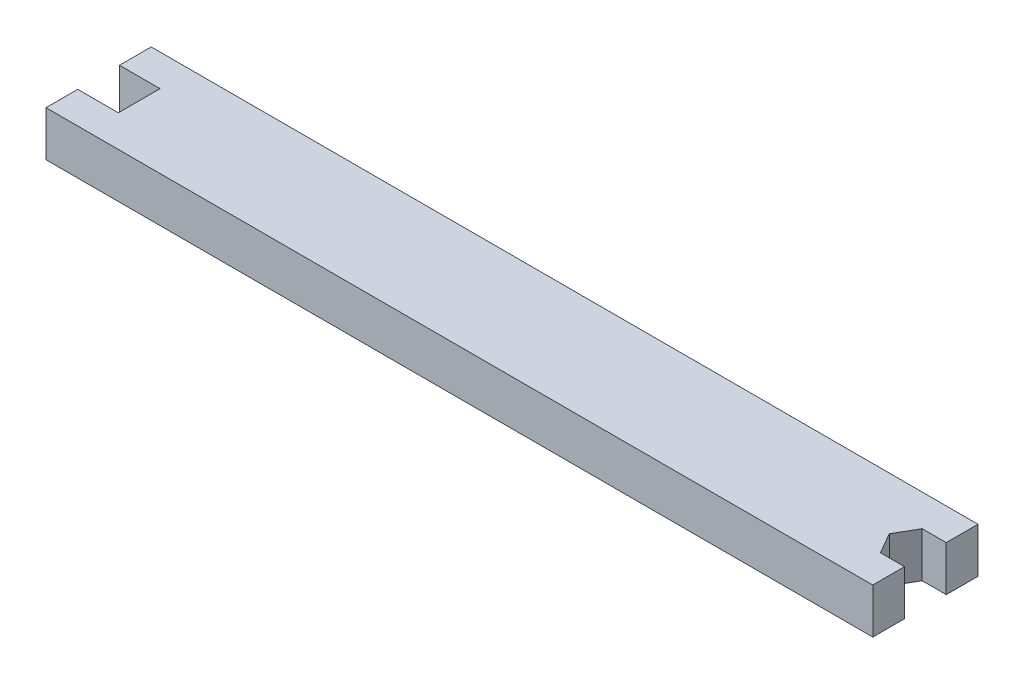
ISO-10303-21;
HEADER;
FILE_DESCRIPTION(('STEP AP214'),'2;1');
FILE_NAME('part.step','',(''),(''),'','','');
FILE_SCHEMA(('AUTOMOTIVE_DESIGN { 1 0 10303 214 1 1 1 1 }'));
ENDSEC;
DATA;
#1=APPLICATION_CONTEXT('core data for automotive mechanical design processes');
#2=APPLICATION_PROTOCOL_DEFINITION('international standard','automotive_design',2000,#1);
#3=PRODUCT_CONTEXT('',#1,'mechanical');
#4=PRODUCT('Part','Part','',(#3));
#5=PRODUCT_RELATED_PRODUCT_CATEGORY('part','',(#4));
#6=PRODUCT_DEFINITION_FORMATION('','',#4);
#7=PRODUCT_DEFINITION_CONTEXT('part definition',#1,'design');
#8=PRODUCT_DEFINITION('design','',#6,#7);
#9=PRODUCT_DEFINITION_SHAPE('','',#8);
#10=(LENGTH_UNIT() NAMED_UNIT(*) SI_UNIT(.MILLI.,.METRE.));
#11=(NAMED_UNIT(*) PLANE_ANGLE_UNIT() SI_UNIT($,.RADIAN.));
#12=(NAMED_UNIT(*) SI_UNIT($,.STERADIAN.) SOLID_ANGLE_UNIT());
#13=UNCERTAINTY_MEASURE_WITH_UNIT(LENGTH_MEASURE(1.E-05),#10,'distance_accuracy_value','');
#14=(GEOMETRIC_REPRESENTATION_CONTEXT(3) GLOBAL_UNCERTAINTY_ASSIGNED_CONTEXT((#13)) GLOBAL_UNIT_ASSIGNED_CONTEXT((#10,
#11,#12)) REPRESENTATION_CONTEXT('',''));
#15=CARTESIAN_POINT('',(0.,0.,0.));
#16=DIRECTION('',(0.,0.,1.));
#17=DIRECTION('',(1.,0.,0.));
#18=AXIS2_PLACEMENT_3D('',#15,#16,#17);
#19=CARTESIAN_POINT('',(110.,6.,82.2413308134273));
#20=DIRECTION('',(-1.,0.,0.));
#21=DIRECTION('',(0.,0.,1.));
#22=AXIS2_PLACEMENT_3D('',#19,#20,#21);
#23=PLANE('',#22);
#24=DIRECTION('',(0.,0.,-1.));
#25=VECTOR('',#24,1.);
#26=CARTESIAN_POINT('',(110.,6.,82.2413308134273));
#27=LINE('',#26,#25);
#28=CARTESIAN_POINT('',(110.,6.,86.4663308134273));
#29=VERTEX_POINT('',#28);
#30=CARTESIAN_POINT('',(110.,6.,82.2413308134273));
#31=VERTEX_POINT('',#30);
#32=EDGE_CURVE('E206',#29,#31,#27,.T.);
#33=ORIENTED_EDGE('',*,*,#32,.F.);
#34=DIRECTION('',(0.,1.,0.));
#35=VECTOR('',#34,1.);
#36=CARTESIAN_POINT('',(110.,0.,86.4663308134273));
#37=LINE('',#36,#35);
#38=CARTESIAN_POINT('',(110.,0.,86.4663308134273));
#39=VERTEX_POINT('',#38);
#40=EDGE_CURVE('E169',#39,#29,#37,.T.);
#41=ORIENTED_EDGE('',*,*,#40,.F.);
#42=DIRECTION('',(0.,0.,-1.));
#43=VECTOR('',#42,1.);
#44=CARTESIAN_POINT('',(110.,0.,82.2413308134273));
#45=LINE('',#44,#43);
#46=CARTESIAN_POINT('',(110.,0.,82.2413308134273));
#47=VERTEX_POINT('',#46);
#48=EDGE_CURVE('E219',#39,#47,#45,.T.);
#49=ORIENTED_EDGE('',*,*,#48,.T.);
#50=DIRECTION('',(0.,-1.,0.));
#51=VECTOR('',#50,1.);
#52=CARTESIAN_POINT('',(110.,6.,82.2413308134273));
#53=LINE('',#52,#51);
#54=EDGE_CURVE('E210',#31,#47,#53,.T.);
#55=ORIENTED_EDGE('',*,*,#54,.F.);
#56=EDGE_LOOP('',(#33,#41,#49,#55));
#57=FACE_BOUND('',#56,.T.);
#58=ADVANCED_FACE('F35',(#57),#23,.F.);
#59=CARTESIAN_POINT('',(0.,6.,82.2413308134273));
#60=DIRECTION('',(1.,0.,0.));
#61=DIRECTION('',(0.,0.,-1.));
#62=AXIS2_PLACEMENT_3D('',#59,#60,#61);
#63=PLANE('',#62);
#64=DIRECTION('',(0.,0.,1.));
#65=VECTOR('',#64,1.);
#66=CARTESIAN_POINT('',(0.,0.,82.2413308134273));
#67=LINE('',#66,#65);
#68=CARTESIAN_POINT('',(0.,0.,82.2413308134273));
#69=VERTEX_POINT('',#68);
#70=CARTESIAN_POINT('',(0.,0.,86.4663308134273));
#71=VERTEX_POINT('',#70);
#72=EDGE_CURVE('E214',#69,#71,#67,.T.);
#73=ORIENTED_EDGE('',*,*,#72,.T.);
#74=DIRECTION('',(0.,1.,0.));
#75=VECTOR('',#74,1.);
#76=CARTESIAN_POINT('',(0.,0.,86.4663308134273));
#77=LINE('',#76,#75);
#78=CARTESIAN_POINT('',(0.,6.,86.4663308134273));
#79=VERTEX_POINT('',#78);
#80=EDGE_CURVE('E187',#71,#79,#77,.T.);
#81=ORIENTED_EDGE('',*,*,#80,.T.);
#82=DIRECTION('',(0.,0.,1.));
#83=VECTOR('',#82,1.);
#84=CARTESIAN_POINT('',(0.,6.,82.2413308134273));
#85=LINE('',#84,#83);
#86=CARTESIAN_POINT('',(0.,6.,82.2413308134273));
#87=VERTEX_POINT('',#86);
#88=EDGE_CURVE('E201',#87,#79,#85,.T.);
#89=ORIENTED_EDGE('',*,*,#88,.F.);
#90=DIRECTION('',(0.,-1.,0.));
#91=VECTOR('',#90,1.);
#92=CARTESIAN_POINT('',(0.,6.,82.2413308134273));
#93=LINE('',#92,#91);
#94=EDGE_CURVE('E11',#87,#69,#93,.T.);
#95=ORIENTED_EDGE('',*,*,#94,.T.);
#96=EDGE_LOOP('',(#73,#81,#89,#95));
#97=FACE_BOUND('',#96,.T.);
#98=ADVANCED_FACE('F251',(#97),#63,.F.);
#99=CARTESIAN_POINT('',(0.,6.,82.2413308134273));
#100=DIRECTION('',(0.,0.,1.));
#101=DIRECTION('',(1.,0.,0.));
#102=AXIS2_PLACEMENT_3D('',#99,#100,#101);
#103=PLANE('',#102);
#104=DIRECTION('',(-1.,0.,0.));
#105=VECTOR('',#104,1.);
#106=CARTESIAN_POINT('',(0.,0.,82.2413308134273));
#107=LINE('',#106,#105);
#108=EDGE_CURVE('E190',#47,#69,#107,.T.);
#109=ORIENTED_EDGE('',*,*,#108,.T.);
#110=ORIENTED_EDGE('',*,*,#94,.F.);
#111=DIRECTION('',(-1.,0.,0.));
#112=VECTOR('',#111,1.);
#113=CARTESIAN_POINT('',(0.,6.,82.2413308134273));
#114=LINE('',#113,#112);
#115=EDGE_CURVE('E196',#31,#87,#114,.T.);
#116=ORIENTED_EDGE('',*,*,#115,.F.);
#117=ORIENTED_EDGE('',*,*,#54,.T.);
#118=EDGE_LOOP('',(#109,#110,#116,#117));
#119=FACE_BOUND('',#118,.T.);
#120=ADVANCED_FACE('F37',(#119),#103,.F.);
#121=CARTESIAN_POINT('',(0.,6.,92.0163308134273));
#122=VERTEX_POINT('',#121);
#123=CARTESIAN_POINT('',(0.,6.,96.2413308134273));
#124=VERTEX_POINT('',#123);
#125=EDGE_CURVE('E199',#122,#124,#85,.T.);
#126=ORIENTED_EDGE('',*,*,#125,.F.);
#127=DIRECTION('',(0.,1.,0.));
#128=VECTOR('',#127,1.);
#129=CARTESIAN_POINT('',(0.,0.,92.0163308134273));
#130=LINE('',#129,#128);
#131=CARTESIAN_POINT('',(0.,0.,92.0163308134273));
#132=VERTEX_POINT('',#131);
#133=EDGE_CURVE('E180',#132,#122,#130,.T.);
#134=ORIENTED_EDGE('',*,*,#133,.F.);
#135=CARTESIAN_POINT('',(0.,0.,96.2413308134273));
#136=VERTEX_POINT('',#135);
#137=EDGE_CURVE('E213',#132,#136,#67,.T.);
#138=ORIENTED_EDGE('',*,*,#137,.T.);
#139=DIRECTION('',(0.,-1.,0.));
#140=VECTOR('',#139,1.);
#141=CARTESIAN_POINT('',(0.,6.,96.2413308134273));
#142=LINE('',#141,#140);
#143=EDGE_CURVE('E43',#124,#136,#142,.T.);
#144=ORIENTED_EDGE('',*,*,#143,.F.);
#145=EDGE_LOOP('',(#126,#134,#138,#144));
#146=FACE_BOUND('',#145,.T.);
#147=ADVANCED_FACE('F244',(#146),#63,.F.);
#148=CARTESIAN_POINT('',(0.,6.,96.2413308134273));
#149=DIRECTION('',(0.,0.,-1.));
#150=DIRECTION('',(-1.,0.,0.));
#151=AXIS2_PLACEMENT_3D('',#148,#149,#150);
#152=PLANE('',#151);
#153=DIRECTION('',(1.,0.,0.));
#154=VECTOR('',#153,1.);
#155=CARTESIAN_POINT('',(0.,0.,96.2413308134273));
#156=LINE('',#155,#154);
#157=CARTESIAN_POINT('',(110.,0.,96.2413308134273));
#158=VERTEX_POINT('',#157);
#159=EDGE_CURVE('E217',#136,#158,#156,.T.);
#160=ORIENTED_EDGE('',*,*,#159,.T.);
#161=DIRECTION('',(0.,-1.,0.));
#162=VECTOR('',#161,1.);
#163=CARTESIAN_POINT('',(110.,6.,96.2413308134273));
#164=LINE('',#163,#162);
#165=CARTESIAN_POINT('',(110.,6.,96.2413308134273));
#166=VERTEX_POINT('',#165);
#167=EDGE_CURVE('E223',#166,#158,#164,.T.);
#168=ORIENTED_EDGE('',*,*,#167,.F.);
#169=DIRECTION('',(1.,0.,0.));
#170=VECTOR('',#169,1.);
#171=CARTESIAN_POINT('',(0.,6.,96.2413308134273));
#172=LINE('',#171,#170);
#173=EDGE_CURVE('E204',#124,#166,#172,.T.);
#174=ORIENTED_EDGE('',*,*,#173,.F.);
#175=ORIENTED_EDGE('',*,*,#143,.T.);
#176=EDGE_LOOP('',(#160,#168,#174,#175));
#177=FACE_BOUND('',#176,.T.);
#178=ADVANCED_FACE('F230',(#177),#152,.F.);
#179=CARTESIAN_POINT('',(110.,0.,92.0163308134273));
#180=VERTEX_POINT('',#179);
#181=EDGE_CURVE('E200',#158,#180,#45,.T.);
#182=ORIENTED_EDGE('',*,*,#181,.T.);
#183=DIRECTION('',(0.,1.,0.));
#184=VECTOR('',#183,1.);
#185=CARTESIAN_POINT('',(110.,0.,92.0163308134273));
#186=LINE('',#185,#184);
#187=CARTESIAN_POINT('',(110.,6.,92.0163308134273));
#188=VERTEX_POINT('',#187);
#189=EDGE_CURVE('E50',#180,#188,#186,.T.);
#190=ORIENTED_EDGE('',*,*,#189,.T.);
#191=EDGE_CURVE('E207',#166,#188,#27,.T.);
#192=ORIENTED_EDGE('',*,*,#191,.F.);
#193=ORIENTED_EDGE('',*,*,#167,.T.);
#194=EDGE_LOOP('',(#182,#190,#192,#193));
#195=FACE_BOUND('',#194,.T.);
#196=ADVANCED_FACE('F236',(#195),#23,.F.);
#197=CARTESIAN_POINT('',(0.,6.,0.));
#198=DIRECTION('',(0.,-1.,0.));
#199=DIRECTION('',(0.,0.,-1.));
#200=AXIS2_PLACEMENT_3D('',#197,#198,#199);
#201=PLANE('',#200);
#202=DIRECTION('',(-0.5,0.,0.866025403784438));
#203=VECTOR('',#202,1.);
#204=CARTESIAN_POINT('',(106.795706005998,6.,86.4663308134273));
#205=LINE('',#204,#203);
#206=CARTESIAN_POINT('',(106.795706005998,6.,86.4663308134273));
#207=VERTEX_POINT('',#206);
#208=CARTESIAN_POINT('',(105.193559008996,6.,89.2413308134274));
#209=VERTEX_POINT('',#208);
#210=EDGE_CURVE('E151',#207,#209,#205,.T.);
#211=ORIENTED_EDGE('',*,*,#210,.F.);
#212=DIRECTION('',(-1.,0.,0.));
#213=VECTOR('',#212,1.);
#214=CARTESIAN_POINT('',(110.,6.,86.4663308134273));
#215=LINE('',#214,#213);
#216=EDGE_CURVE('E154',#29,#207,#215,.T.);
#217=ORIENTED_EDGE('',*,*,#216,.F.);
#218=ORIENTED_EDGE('',*,*,#32,.T.);
#219=ORIENTED_EDGE('',*,*,#115,.T.);
#220=ORIENTED_EDGE('',*,*,#88,.T.);
#221=DIRECTION('',(-1.,0.,0.));
#222=VECTOR('',#221,1.);
#223=CARTESIAN_POINT('',(0.,6.,86.4663308134273));
#224=LINE('',#223,#222);
#225=CARTESIAN_POINT('',(5.4,6.,86.4663308134273));
#226=VERTEX_POINT('',#225);
#227=EDGE_CURVE('E175',#226,#79,#224,.T.);
#228=ORIENTED_EDGE('',*,*,#227,.F.);
#229=DIRECTION('',(0.,0.,-1.));
#230=VECTOR('',#229,1.);
#231=CARTESIAN_POINT('',(5.4,6.,86.4663308134273));
#232=LINE('',#231,#230);
#233=CARTESIAN_POINT('',(5.4,6.,92.0163308134273));
#234=VERTEX_POINT('',#233);
#235=EDGE_CURVE('E183',#234,#226,#232,.T.);
#236=ORIENTED_EDGE('',*,*,#235,.F.);
#237=DIRECTION('',(1.,0.,0.));
#238=VECTOR('',#237,1.);
#239=CARTESIAN_POINT('',(0.,6.,92.0163308134273));
#240=LINE('',#239,#238);
#241=EDGE_CURVE('E166',#122,#234,#240,.T.);
#242=ORIENTED_EDGE('',*,*,#241,.F.);
#243=ORIENTED_EDGE('',*,*,#125,.T.);
#244=ORIENTED_EDGE('',*,*,#173,.T.);
#245=ORIENTED_EDGE('',*,*,#191,.T.);
#246=DIRECTION('',(1.,0.,0.));
#247=VECTOR('',#246,1.);
#248=CARTESIAN_POINT('',(106.795706005998,6.,92.0163308134273));
#249=LINE('',#248,#247);
#250=CARTESIAN_POINT('',(106.795706005998,6.,92.0163308134273));
#251=VERTEX_POINT('',#250);
#252=EDGE_CURVE('E160',#251,#188,#249,.T.);
#253=ORIENTED_EDGE('',*,*,#252,.F.);
#254=DIRECTION('',(0.500000000000003,0.,0.866025403784437));
#255=VECTOR('',#254,1.);
#256=CARTESIAN_POINT('',(105.193559008996,6.,89.2413308134274));
#257=LINE('',#256,#255);
#258=EDGE_CURVE('E137',#209,#251,#257,.T.);
#259=ORIENTED_EDGE('',*,*,#258,.F.);
#260=EDGE_LOOP('',(#211,#217,#218,#219,#220,#228,#236,#242,#243,#244,#245,#253,#259));
#261=FACE_BOUND('',#260,.T.);
#262=ADVANCED_FACE('F240',(#261),#201,.F.);
#263=CARTESIAN_POINT('',(0.,0.,0.));
#264=DIRECTION('',(0.,-1.,0.));
#265=DIRECTION('',(0.,0.,-1.));
#266=AXIS2_PLACEMENT_3D('',#263,#264,#265);
#267=PLANE('',#266);
#268=DIRECTION('',(-1.,0.,0.));
#269=VECTOR('',#268,1.);
#270=CARTESIAN_POINT('',(110.,0.,86.4663308134273));
#271=LINE('',#270,#269);
#272=CARTESIAN_POINT('',(106.795706005998,0.,86.4663308134273));
#273=VERTEX_POINT('',#272);
#274=EDGE_CURVE('E146',#39,#273,#271,.T.);
#275=ORIENTED_EDGE('',*,*,#274,.T.);
#276=DIRECTION('',(-0.5,0.,0.866025403784438));
#277=VECTOR('',#276,1.);
#278=CARTESIAN_POINT('',(106.795706005998,0.,86.4663308134273));
#279=LINE('',#278,#277);
#280=CARTESIAN_POINT('',(105.193559008996,0.,89.2413308134274));
#281=VERTEX_POINT('',#280);
#282=EDGE_CURVE('E139',#273,#281,#279,.T.);
#283=ORIENTED_EDGE('',*,*,#282,.T.);
#284=DIRECTION('',(0.500000000000003,0.,0.866025403784437));
#285=VECTOR('',#284,1.);
#286=CARTESIAN_POINT('',(105.193559008996,0.,89.2413308134274));
#287=LINE('',#286,#285);
#288=CARTESIAN_POINT('',(106.795706005998,0.,92.0163308134273));
#289=VERTEX_POINT('',#288);
#290=EDGE_CURVE('E134',#281,#289,#287,.T.);
#291=ORIENTED_EDGE('',*,*,#290,.T.);
#292=DIRECTION('',(1.,0.,0.));
#293=VECTOR('',#292,1.);
#294=CARTESIAN_POINT('',(106.795706005998,0.,92.0163308134273));
#295=LINE('',#294,#293);
#296=EDGE_CURVE('E141',#289,#180,#295,.T.);
#297=ORIENTED_EDGE('',*,*,#296,.T.);
#298=ORIENTED_EDGE('',*,*,#181,.F.);
#299=ORIENTED_EDGE('',*,*,#159,.F.);
#300=ORIENTED_EDGE('',*,*,#137,.F.);
#301=DIRECTION('',(1.,0.,0.));
#302=VECTOR('',#301,1.);
#303=CARTESIAN_POINT('',(0.,0.,92.0163308134273));
#304=LINE('',#303,#302);
#305=CARTESIAN_POINT('',(5.4,0.,92.0163308134273));
#306=VERTEX_POINT('',#305);
#307=EDGE_CURVE('E172',#132,#306,#304,.T.);
#308=ORIENTED_EDGE('',*,*,#307,.T.);
#309=DIRECTION('',(0.,0.,-1.));
#310=VECTOR('',#309,1.);
#311=CARTESIAN_POINT('',(5.4,0.,86.4663308134273));
#312=LINE('',#311,#310);
#313=CARTESIAN_POINT('',(5.4,0.,86.4663308134273));
#314=VERTEX_POINT('',#313);
#315=EDGE_CURVE('E58',#306,#314,#312,.T.);
#316=ORIENTED_EDGE('',*,*,#315,.T.);
#317=DIRECTION('',(-1.,0.,0.));
#318=VECTOR('',#317,1.);
#319=CARTESIAN_POINT('',(0.,0.,86.4663308134273));
#320=LINE('',#319,#318);
#321=EDGE_CURVE('E177',#314,#71,#320,.T.);
#322=ORIENTED_EDGE('',*,*,#321,.T.);
#323=ORIENTED_EDGE('',*,*,#72,.F.);
#324=ORIENTED_EDGE('',*,*,#108,.F.);
#325=ORIENTED_EDGE('',*,*,#48,.F.);
#326=EDGE_LOOP('',(#275,#283,#291,#297,#298,#299,#300,#308,#316,#322,#323,#324,#325));
#327=FACE_BOUND('',#326,.T.);
#328=ADVANCED_FACE('F149',(#327),#267,.T.);
#329=CARTESIAN_POINT('',(0.,0.,86.4663308134273));
#330=DIRECTION('',(0.,0.,-1.));
#331=DIRECTION('',(-1.,0.,0.));
#332=AXIS2_PLACEMENT_3D('',#329,#330,#331);
#333=PLANE('',#332);
#334=ORIENTED_EDGE('',*,*,#227,.T.);
#335=ORIENTED_EDGE('',*,*,#80,.F.);
#336=ORIENTED_EDGE('',*,*,#321,.F.);
#337=DIRECTION('',(0.,1.,0.));
#338=VECTOR('',#337,1.);
#339=CARTESIAN_POINT('',(5.4,0.,86.4663308134273));
#340=LINE('',#339,#338);
#341=EDGE_CURVE('E191',#314,#226,#340,.T.);
#342=ORIENTED_EDGE('',*,*,#341,.T.);
#343=EDGE_LOOP('',(#334,#335,#336,#342));
#344=FACE_BOUND('',#343,.T.);
#345=ADVANCED_FACE('F311',(#344),#333,.F.);
#346=CARTESIAN_POINT('',(5.4,0.,86.4663308134273));
#347=DIRECTION('',(1.,0.,0.));
#348=DIRECTION('',(0.,0.,-1.));
#349=AXIS2_PLACEMENT_3D('',#346,#347,#348);
#350=PLANE('',#349);
#351=ORIENTED_EDGE('',*,*,#235,.T.);
#352=ORIENTED_EDGE('',*,*,#341,.F.);
#353=ORIENTED_EDGE('',*,*,#315,.F.);
#354=DIRECTION('',(0.,1.,0.));
#355=VECTOR('',#354,1.);
#356=CARTESIAN_POINT('',(5.4,0.,92.0163308134273));
#357=LINE('',#356,#355);
#358=EDGE_CURVE('E193',#306,#234,#357,.T.);
#359=ORIENTED_EDGE('',*,*,#358,.T.);
#360=EDGE_LOOP('',(#351,#352,#353,#359));
#361=FACE_BOUND('',#360,.T.);
#362=ADVANCED_FACE('F315',(#361),#350,.F.);
#363=CARTESIAN_POINT('',(0.,0.,92.0163308134273));
#364=DIRECTION('',(0.,0.,1.));
#365=DIRECTION('',(1.,0.,0.));
#366=AXIS2_PLACEMENT_3D('',#363,#364,#365);
#367=PLANE('',#366);
#368=ORIENTED_EDGE('',*,*,#241,.T.);
#369=ORIENTED_EDGE('',*,*,#358,.F.);
#370=ORIENTED_EDGE('',*,*,#307,.F.);
#371=ORIENTED_EDGE('',*,*,#133,.T.);
#372=EDGE_LOOP('',(#368,#369,#370,#371));
#373=FACE_BOUND('',#372,.T.);
#374=ADVANCED_FACE('F246',(#373),#367,.F.);
#375=CARTESIAN_POINT('',(105.193559008996,0.,89.2413308134274));
#376=DIRECTION('',(-0.866025403784437,0.,0.500000000000003));
#377=DIRECTION('',(0.500000000000003,0.,0.866025403784437));
#378=AXIS2_PLACEMENT_3D('',#375,#376,#377);
#379=PLANE('',#378);
#380=ORIENTED_EDGE('',*,*,#258,.T.);
#381=DIRECTION('',(0.,1.,0.));
#382=VECTOR('',#381,1.);
#383=CARTESIAN_POINT('',(106.795706005998,0.,92.0163308134273));
#384=LINE('',#383,#382);
#385=EDGE_CURVE('E131',#289,#251,#384,.T.);
#386=ORIENTED_EDGE('',*,*,#385,.F.);
#387=ORIENTED_EDGE('',*,*,#290,.F.);
#388=DIRECTION('',(0.,1.,0.));
#389=VECTOR('',#388,1.);
#390=CARTESIAN_POINT('',(105.193559008996,0.,89.2413308134274));
#391=LINE('',#390,#389);
#392=EDGE_CURVE('E164',#281,#209,#391,.T.);
#393=ORIENTED_EDGE('',*,*,#392,.T.);
#394=EDGE_LOOP('',(#380,#386,#387,#393));
#395=FACE_BOUND('',#394,.T.);
#396=ADVANCED_FACE('F132',(#395),#379,.F.);
#397=CARTESIAN_POINT('',(106.795706005998,0.,86.4663308134273));
#398=DIRECTION('',(-0.866025403784438,0.,-0.5));
#399=DIRECTION('',(-0.5,0.,0.866025403784439));
#400=AXIS2_PLACEMENT_3D('',#397,#398,#399);
#401=PLANE('',#400);
#402=ORIENTED_EDGE('',*,*,#210,.T.);
#403=ORIENTED_EDGE('',*,*,#392,.F.);
#404=ORIENTED_EDGE('',*,*,#282,.F.);
#405=DIRECTION('',(0.,1.,0.));
#406=VECTOR('',#405,1.);
#407=CARTESIAN_POINT('',(106.795706005998,0.,86.4663308134273));
#408=LINE('',#407,#406);
#409=EDGE_CURVE('E167',#273,#207,#408,.T.);
#410=ORIENTED_EDGE('',*,*,#409,.T.);
#411=EDGE_LOOP('',(#402,#403,#404,#410));
#412=FACE_BOUND('',#411,.T.);
#413=ADVANCED_FACE('F264',(#412),#401,.F.);
#414=CARTESIAN_POINT('',(110.,0.,86.4663308134273));
#415=DIRECTION('',(0.,0.,-1.));
#416=DIRECTION('',(-1.,0.,0.));
#417=AXIS2_PLACEMENT_3D('',#414,#415,#416);
#418=PLANE('',#417);
#419=ORIENTED_EDGE('',*,*,#216,.T.);
#420=ORIENTED_EDGE('',*,*,#409,.F.);
#421=ORIENTED_EDGE('',*,*,#274,.F.);
#422=ORIENTED_EDGE('',*,*,#40,.T.);
#423=EDGE_LOOP('',(#419,#420,#421,#422));
#424=FACE_BOUND('',#423,.T.);
#425=ADVANCED_FACE('F262',(#424),#418,.F.);
#426=CARTESIAN_POINT('',(106.795706005998,0.,92.0163308134273));
#427=DIRECTION('',(0.,0.,1.));
#428=DIRECTION('',(1.,0.,0.));
#429=AXIS2_PLACEMENT_3D('',#426,#427,#428);
#430=PLANE('',#429);
#431=ORIENTED_EDGE('',*,*,#252,.T.);
#432=ORIENTED_EDGE('',*,*,#189,.F.);
#433=ORIENTED_EDGE('',*,*,#296,.F.);
#434=ORIENTED_EDGE('',*,*,#385,.T.);
#435=EDGE_LOOP('',(#431,#432,#433,#434));
#436=FACE_BOUND('',#435,.T.);
#437=ADVANCED_FACE('F142',(#436),#430,.F.);
#438=CLOSED_SHELL('',(#58,#98,#120,#147,#178,#196,#262,#328,#345,#362,#374,#396,#413,#425,#437));
#439=MANIFOLD_SOLID_BREP('B2',#438);
#440=ADVANCED_BREP_SHAPE_REPRESENTATION('',(#18,#439),#14);
#441=SHAPE_DEFINITION_REPRESENTATION(#9,#440);
ENDSEC;
END-ISO-10303-21;
